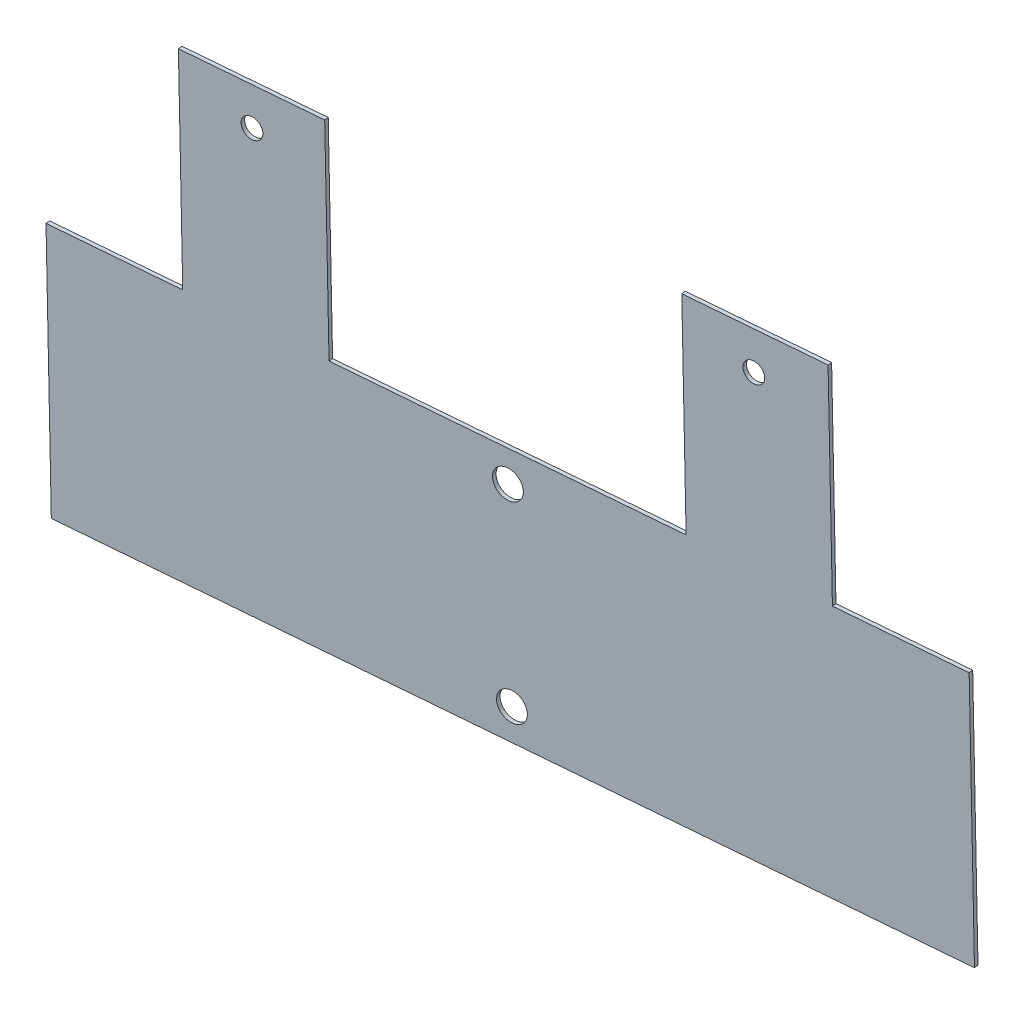
ISO-10303-21;
HEADER;
FILE_DESCRIPTION(('STEP AP214'),'2;1');
FILE_NAME('part.step','',(''),(''),'','','');
FILE_SCHEMA(('AUTOMOTIVE_DESIGN { 1 0 10303 214 1 1 1 1 }'));
ENDSEC;
DATA;
#1=APPLICATION_CONTEXT('core data for automotive mechanical design processes');
#2=APPLICATION_PROTOCOL_DEFINITION('international standard','automotive_design',2000,#1);
#3=PRODUCT_CONTEXT('',#1,'mechanical');
#4=PRODUCT('Part','Part','',(#3));
#5=PRODUCT_RELATED_PRODUCT_CATEGORY('part','',(#4));
#6=PRODUCT_DEFINITION_FORMATION('','',#4);
#7=PRODUCT_DEFINITION_CONTEXT('part definition',#1,'design');
#8=PRODUCT_DEFINITION('design','',#6,#7);
#9=PRODUCT_DEFINITION_SHAPE('','',#8);
#10=(LENGTH_UNIT() NAMED_UNIT(*) SI_UNIT(.MILLI.,.METRE.));
#11=(NAMED_UNIT(*) PLANE_ANGLE_UNIT() SI_UNIT($,.RADIAN.));
#12=(NAMED_UNIT(*) SI_UNIT($,.STERADIAN.) SOLID_ANGLE_UNIT());
#13=UNCERTAINTY_MEASURE_WITH_UNIT(LENGTH_MEASURE(1.E-05),#10,'distance_accuracy_value','');
#14=(GEOMETRIC_REPRESENTATION_CONTEXT(3) GLOBAL_UNCERTAINTY_ASSIGNED_CONTEXT((#13)) GLOBAL_UNIT_ASSIGNED_CONTEXT((#10,
#11,#12)) REPRESENTATION_CONTEXT('',''));
#15=CARTESIAN_POINT('',(0.,0.,0.));
#16=DIRECTION('',(0.,0.,1.));
#17=DIRECTION('',(1.,0.,0.));
#18=AXIS2_PLACEMENT_3D('',#15,#16,#17);
#19=CARTESIAN_POINT('',(-501.489956429642,-328.947406139133,240.499575413323));
#20=DIRECTION('',(0.99656940991837,0.00195950965151666,-0.0827379691367708));
#21=DIRECTION('',(-0.0827381279808112,0.,-0.996571323176736));
#22=AXIS2_PLACEMENT_3D('',#19,#20,#21);
#23=PLANE('',#22);
#24=DIRECTION('',(-0.00028055772663787,0.999793911631424,0.0202991515117986));
#25=VECTOR('',#24,1.);
#26=CARTESIAN_POINT('',(-501.439505510465,-328.959723900019,241.106959260261));
#27=LINE('',#26,#25);
#28=CARTESIAN_POINT('',(-501.439505510465,-328.959723900019,241.106959260261));
#29=VERTEX_POINT('',#28);
#30=CARTESIAN_POINT('',(-501.450907376476,-288.328099331318,241.9319167777));
#31=VERTEX_POINT('',#30);
#32=EDGE_CURVE('E176',#29,#31,#27,.T.);
#33=ORIENTED_EDGE('',*,*,#32,.T.);
#34=DIRECTION('',(0.082760694186997,-0.0202063006674291,0.99636457831008));
#35=VECTOR('',#34,1.);
#36=CARTESIAN_POINT('',(-501.501358295652,-288.315781570432,241.324532930762));
#37=LINE('',#36,#35);
#38=CARTESIAN_POINT('',(-501.501358295652,-288.315781570432,241.324532930762));
#39=VERTEX_POINT('',#38);
#40=EDGE_CURVE('E12',#39,#31,#37,.T.);
#41=ORIENTED_EDGE('',*,*,#40,.F.);
#42=DIRECTION('',(-0.00028055772663787,0.999793911631424,0.0202991515117986));
#43=VECTOR('',#42,1.);
#44=CARTESIAN_POINT('',(-501.489956429642,-328.947406139133,240.499575413323));
#45=LINE('',#44,#43);
#46=CARTESIAN_POINT('',(-501.489956429642,-328.947406139133,240.499575413323));
#47=VERTEX_POINT('',#46);
#48=EDGE_CURVE('E212',#47,#39,#45,.T.);
#49=ORIENTED_EDGE('',*,*,#48,.F.);
#50=DIRECTION('',(0.082760694186997,-0.0202063006674291,0.99636457831008));
#51=VECTOR('',#50,1.);
#52=CARTESIAN_POINT('',(-501.489956429642,-328.947406139133,240.499575413323));
#53=LINE('',#52,#51);
#54=EDGE_CURVE('E172',#47,#29,#53,.T.);
#55=ORIENTED_EDGE('',*,*,#54,.T.);
#56=EDGE_LOOP('',(#33,#41,#49,#55));
#57=FACE_BOUND('',#56,.T.);
#58=ADVANCED_FACE('F49',(#57),#23,.F.);
#59=CARTESIAN_POINT('',(-501.501358295652,-288.315781570432,241.324532930762));
#60=DIRECTION('',(0.000280557726639362,-0.999793911631424,-0.0202991515117987));
#61=DIRECTION('',(0.,0.0202991523106987,-0.999793950979634));
#62=AXIS2_PLACEMENT_3D('',#59,#60,#61);
#63=PLANE('',#62);
#64=DIRECTION('',(0.99656940991837,0.00195950965151815,-0.0827379691367705));
#65=VECTOR('',#64,1.);
#66=CARTESIAN_POINT('',(-501.450907376476,-288.328099331318,241.9319167777));
#67=LINE('',#66,#65);
#68=CARTESIAN_POINT('',(-481.580309912113,-288.289028668377,240.282204411082));
#69=VERTEX_POINT('',#68);
#70=EDGE_CURVE('E180',#31,#69,#67,.T.);
#71=ORIENTED_EDGE('',*,*,#70,.T.);
#72=DIRECTION('',(0.082760694186997,-0.0202063006674291,0.99636457831008));
#73=VECTOR('',#72,1.);
#74=CARTESIAN_POINT('',(-481.63076083129,-288.27671090749,239.674820564144));
#75=LINE('',#74,#73);
#76=CARTESIAN_POINT('',(-481.63076083129,-288.27671090749,239.674820564144));
#77=VERTEX_POINT('',#76);
#78=EDGE_CURVE('E58',#77,#69,#75,.T.);
#79=ORIENTED_EDGE('',*,*,#78,.F.);
#80=DIRECTION('',(0.99656940991837,0.00195950965151815,-0.0827379691367705));
#81=VECTOR('',#80,1.);
#82=CARTESIAN_POINT('',(-501.501358295652,-288.315781570432,241.324532930762));
#83=LINE('',#82,#81);
#84=EDGE_CURVE('E119',#39,#77,#83,.T.);
#85=ORIENTED_EDGE('',*,*,#84,.F.);
#86=ORIENTED_EDGE('',*,*,#40,.T.);
#87=EDGE_LOOP('',(#71,#79,#85,#86));
#88=FACE_BOUND('',#87,.T.);
#89=ADVANCED_FACE('F357',(#88),#63,.F.);
#90=CARTESIAN_POINT('',(-481.63076083129,-288.27671090749,239.674820564144));
#91=DIRECTION('',(0.99656940991837,0.00195950965151761,-0.0827379691367708));
#92=DIRECTION('',(-0.0827381279808112,0.,-0.996571323176736));
#93=AXIS2_PLACEMENT_3D('',#90,#91,#92);
#94=PLANE('',#93);
#95=DIRECTION('',(-0.000280557726638828,0.999793911631424,0.0202991515117985));
#96=VECTOR('',#95,1.);
#97=CARTESIAN_POINT('',(-481.580309912113,-288.289028668377,240.282204411082));
#98=LINE('',#97,#96);
#99=CARTESIAN_POINT('',(-481.589628158372,-255.082579541952,240.956406098194));
#100=VERTEX_POINT('',#99);
#101=EDGE_CURVE('E184',#69,#100,#98,.T.);
#102=ORIENTED_EDGE('',*,*,#101,.T.);
#103=DIRECTION('',(0.082760694186997,-0.0202063006674291,0.99636457831008));
#104=VECTOR('',#103,1.);
#105=CARTESIAN_POINT('',(-481.640079077549,-255.070261781065,240.349022251256));
#106=LINE('',#105,#104);
#107=CARTESIAN_POINT('',(-481.640079077549,-255.070261781065,240.349022251256));
#108=VERTEX_POINT('',#107);
#109=EDGE_CURVE('E238',#108,#100,#106,.T.);
#110=ORIENTED_EDGE('',*,*,#109,.F.);
#111=DIRECTION('',(-0.000280557726638828,0.999793911631424,0.0202991515117985));
#112=VECTOR('',#111,1.);
#113=CARTESIAN_POINT('',(-481.63076083129,-288.27671090749,239.674820564144));
#114=LINE('',#113,#112);
#115=EDGE_CURVE('E248',#77,#108,#114,.T.);
#116=ORIENTED_EDGE('',*,*,#115,.F.);
#117=ORIENTED_EDGE('',*,*,#78,.T.);
#118=EDGE_LOOP('',(#102,#110,#116,#117));
#119=FACE_BOUND('',#118,.T.);
#120=ADVANCED_FACE('F246',(#119),#94,.F.);
#121=CARTESIAN_POINT('',(-481.640079077549,-255.070261781065,240.349022251256));
#122=DIRECTION('',(0.000280557726637702,-0.999793911631424,-0.0202991515117986));
#123=DIRECTION('',(0.,0.0202991523106985,-0.999793950979634));
#124=AXIS2_PLACEMENT_3D('',#121,#122,#123);
#125=PLANE('',#124);
#126=DIRECTION('',(0.99656940991837,0.00195950965151649,-0.0827379691367709));
#127=VECTOR('',#126,1.);
#128=CARTESIAN_POINT('',(-481.589628158372,-255.082579541952,240.956406098194));
#129=LINE('',#128,#127);
#130=CARTESIAN_POINT('',(-460.326823228354,-255.040771444027,239.191108788692));
#131=VERTEX_POINT('',#130);
#132=EDGE_CURVE('E187',#100,#131,#129,.T.);
#133=ORIENTED_EDGE('',*,*,#132,.T.);
#134=DIRECTION('',(0.082760694186997,-0.0202063006674291,0.99636457831008));
#135=VECTOR('',#134,1.);
#136=CARTESIAN_POINT('',(-460.37727414753,-255.028453683141,238.583724941754));
#137=LINE('',#136,#135);
#138=CARTESIAN_POINT('',(-460.37727414753,-255.028453683141,238.583724941754));
#139=VERTEX_POINT('',#138);
#140=EDGE_CURVE('E234',#139,#131,#137,.T.);
#141=ORIENTED_EDGE('',*,*,#140,.F.);
#142=DIRECTION('',(0.99656940991837,0.00195950965151649,-0.0827379691367709));
#143=VECTOR('',#142,1.);
#144=CARTESIAN_POINT('',(-481.640079077549,-255.070261781065,240.349022251256));
#145=LINE('',#144,#143);
#146=EDGE_CURVE('E265',#108,#139,#145,.T.);
#147=ORIENTED_EDGE('',*,*,#146,.F.);
#148=ORIENTED_EDGE('',*,*,#109,.T.);
#149=EDGE_LOOP('',(#133,#141,#147,#148));
#150=FACE_BOUND('',#149,.T.);
#151=ADVANCED_FACE('F255',(#150),#125,.F.);
#152=CARTESIAN_POINT('',(-460.367955901271,-288.234902809565,237.909523254642));
#153=DIRECTION('',(-0.99656940991837,-0.00195950965151761,0.0827379691367708));
#154=DIRECTION('',(0.0827381279808112,0.,0.996571323176736));
#155=AXIS2_PLACEMENT_3D('',#152,#153,#154);
#156=PLANE('',#155);
#157=DIRECTION('',(0.000280557726638828,-0.999793911631424,-0.0202991515117985));
#158=VECTOR('',#157,1.);
#159=CARTESIAN_POINT('',(-460.317504982095,-288.247220570452,238.51690710158));
#160=LINE('',#159,#158);
#161=CARTESIAN_POINT('',(-460.317504982095,-288.247220570452,238.51690710158));
#162=VERTEX_POINT('',#161);
#163=EDGE_CURVE('E190',#131,#162,#160,.T.);
#164=ORIENTED_EDGE('',*,*,#163,.T.);
#165=DIRECTION('',(0.082760694186997,-0.0202063006674291,0.99636457831008));
#166=VECTOR('',#165,1.);
#167=CARTESIAN_POINT('',(-460.367955901271,-288.234902809565,237.909523254642));
#168=LINE('',#167,#166);
#169=CARTESIAN_POINT('',(-460.367955901271,-288.234902809565,237.909523254642));
#170=VERTEX_POINT('',#169);
#171=EDGE_CURVE('E230',#170,#162,#168,.T.);
#172=ORIENTED_EDGE('',*,*,#171,.F.);
#173=DIRECTION('',(0.000280557726638828,-0.999793911631424,-0.0202991515117985));
#174=VECTOR('',#173,1.);
#175=CARTESIAN_POINT('',(-460.367955901271,-288.234902809565,237.909523254642));
#176=LINE('',#175,#174);
#177=EDGE_CURVE('E261',#139,#170,#176,.T.);
#178=ORIENTED_EDGE('',*,*,#177,.F.);
#179=ORIENTED_EDGE('',*,*,#140,.T.);
#180=EDGE_LOOP('',(#164,#172,#178,#179));
#181=FACE_BOUND('',#180,.T.);
#182=ADVANCED_FACE('F259',(#181),#156,.F.);
#183=CARTESIAN_POINT('',(-460.367955901271,-288.234902809565,237.909523254642));
#184=DIRECTION('',(0.000280557726638659,-0.999793911631424,-0.0202991515117987));
#185=DIRECTION('',(0.,0.0202991523106986,-0.999793950979634));
#186=AXIS2_PLACEMENT_3D('',#183,#184,#185);
#187=PLANE('',#186);
#188=DIRECTION('',(0.99656940991837,0.00195950965151746,-0.0827379691367711));
#189=VECTOR('',#188,1.);
#190=CARTESIAN_POINT('',(-460.317504982095,-288.247220570452,238.51690710158));
#191=LINE('',#190,#189);
#192=CARTESIAN_POINT('',(-408.426135807645,-288.145188902897,234.208741048628));
#193=VERTEX_POINT('',#192);
#194=EDGE_CURVE('E193',#162,#193,#191,.T.);
#195=ORIENTED_EDGE('',*,*,#194,.T.);
#196=DIRECTION('',(0.082760694186997,-0.0202063006674291,0.99636457831008));
#197=VECTOR('',#196,1.);
#198=CARTESIAN_POINT('',(-408.476586726822,-288.132871142011,233.60135720169));
#199=LINE('',#198,#197);
#200=CARTESIAN_POINT('',(-408.476586726822,-288.132871142011,233.60135720169));
#201=VERTEX_POINT('',#200);
#202=EDGE_CURVE('E226',#201,#193,#199,.T.);
#203=ORIENTED_EDGE('',*,*,#202,.F.);
#204=DIRECTION('',(0.99656940991837,0.00195950965151746,-0.0827379691367711));
#205=VECTOR('',#204,1.);
#206=CARTESIAN_POINT('',(-460.367955901271,-288.234902809565,237.909523254642));
#207=LINE('',#206,#205);
#208=EDGE_CURVE('E264',#170,#201,#207,.T.);
#209=ORIENTED_EDGE('',*,*,#208,.F.);
#210=ORIENTED_EDGE('',*,*,#171,.T.);
#211=EDGE_LOOP('',(#195,#203,#209,#210));
#212=FACE_BOUND('',#211,.T.);
#213=ADVANCED_FACE('F370',(#212),#187,.F.);
#214=CARTESIAN_POINT('',(-408.476586726822,-288.132871142011,233.60135720169));
#215=DIRECTION('',(0.99656940991837,0.00195950965151767,-0.0827379691367708));
#216=DIRECTION('',(-0.0827381279808112,0.,-0.996571323176736));
#217=AXIS2_PLACEMENT_3D('',#214,#215,#216);
#218=PLANE('',#217);
#219=DIRECTION('',(-0.000280557726638828,0.999793911631424,0.0202991515117993));
#220=VECTOR('',#219,1.);
#221=CARTESIAN_POINT('',(-408.426135807645,-288.145188902897,234.208741048628));
#222=LINE('',#221,#220);
#223=CARTESIAN_POINT('',(-408.435454053904,-254.938739776473,234.88294273574));
#224=VERTEX_POINT('',#223);
#225=EDGE_CURVE('E196',#193,#224,#222,.T.);
#226=ORIENTED_EDGE('',*,*,#225,.T.);
#227=DIRECTION('',(0.082760694186997,-0.0202063006674291,0.99636457831008));
#228=VECTOR('',#227,1.);
#229=CARTESIAN_POINT('',(-408.485904973081,-254.926422015586,234.275558888802));
#230=LINE('',#229,#228);
#231=CARTESIAN_POINT('',(-408.485904973081,-254.926422015586,234.275558888802));
#232=VERTEX_POINT('',#231);
#233=EDGE_CURVE('E222',#232,#224,#230,.T.);
#234=ORIENTED_EDGE('',*,*,#233,.F.);
#235=DIRECTION('',(-0.000280557726638828,0.999793911631424,0.0202991515117993));
#236=VECTOR('',#235,1.);
#237=CARTESIAN_POINT('',(-408.476586726822,-288.132871142011,233.60135720169));
#238=LINE('',#237,#236);
#239=EDGE_CURVE('E269',#201,#232,#238,.T.);
#240=ORIENTED_EDGE('',*,*,#239,.F.);
#241=ORIENTED_EDGE('',*,*,#202,.T.);
#242=EDGE_LOOP('',(#226,#234,#240,#241));
#243=FACE_BOUND('',#242,.T.);
#244=ADVANCED_FACE('F373',(#243),#218,.F.);
#245=CARTESIAN_POINT('',(-408.485904973081,-254.926422015586,234.275558888802));
#246=DIRECTION('',(0.000280557726637702,-0.999793911631424,-0.0202991515117986));
#247=DIRECTION('',(0.,0.0202991523106985,-0.999793950979634));
#248=AXIS2_PLACEMENT_3D('',#245,#246,#247);
#249=PLANE('',#248);
#250=DIRECTION('',(0.99656940991837,0.00195950965151649,-0.0827379691367709));
#251=VECTOR('',#250,1.);
#252=CARTESIAN_POINT('',(-408.435454053904,-254.938739776473,234.88294273574));
#253=LINE('',#252,#251);
#254=CARTESIAN_POINT('',(-387.172649123886,-254.896931678548,233.117645426238));
#255=VERTEX_POINT('',#254);
#256=EDGE_CURVE('E199',#224,#255,#253,.T.);
#257=ORIENTED_EDGE('',*,*,#256,.T.);
#258=DIRECTION('',(0.082760694186997,-0.0202063006674291,0.99636457831008));
#259=VECTOR('',#258,1.);
#260=CARTESIAN_POINT('',(-387.223100043062,-254.884613917661,232.5102615793));
#261=LINE('',#260,#259);
#262=CARTESIAN_POINT('',(-387.223100043062,-254.884613917661,232.5102615793));
#263=VERTEX_POINT('',#262);
#264=EDGE_CURVE('E218',#263,#255,#261,.T.);
#265=ORIENTED_EDGE('',*,*,#264,.F.);
#266=DIRECTION('',(0.99656940991837,0.00195950965151649,-0.0827379691367709));
#267=VECTOR('',#266,1.);
#268=CARTESIAN_POINT('',(-408.485904973081,-254.926422015586,234.275558888802));
#269=LINE('',#268,#267);
#270=EDGE_CURVE('E276',#232,#263,#269,.T.);
#271=ORIENTED_EDGE('',*,*,#270,.F.);
#272=ORIENTED_EDGE('',*,*,#233,.T.);
#273=EDGE_LOOP('',(#257,#265,#271,#272));
#274=FACE_BOUND('',#273,.T.);
#275=ADVANCED_FACE('F284',(#274),#249,.F.);
#276=CARTESIAN_POINT('',(-387.213781796803,-288.091063044086,231.836059892188));
#277=DIRECTION('',(-0.99656940991837,-0.00195950965151761,0.0827379691367708));
#278=DIRECTION('',(0.0827381279808112,0.,0.996571323176736));
#279=AXIS2_PLACEMENT_3D('',#276,#277,#278);
#280=PLANE('',#279);
#281=DIRECTION('',(0.000280557726638828,-0.999793911631424,-0.0202991515117985));
#282=VECTOR('',#281,1.);
#283=CARTESIAN_POINT('',(-387.163330877627,-288.103380804973,232.443443739126));
#284=LINE('',#283,#282);
#285=CARTESIAN_POINT('',(-387.163330877627,-288.103380804973,232.443443739126));
#286=VERTEX_POINT('',#285);
#287=EDGE_CURVE('E202',#255,#286,#284,.T.);
#288=ORIENTED_EDGE('',*,*,#287,.T.);
#289=DIRECTION('',(0.082760694186997,-0.0202063006674291,0.99636457831008));
#290=VECTOR('',#289,1.);
#291=CARTESIAN_POINT('',(-387.213781796803,-288.091063044086,231.836059892188));
#292=LINE('',#291,#290);
#293=CARTESIAN_POINT('',(-387.213781796803,-288.091063044086,231.836059892188));
#294=VERTEX_POINT('',#293);
#295=EDGE_CURVE('E164',#294,#286,#292,.T.);
#296=ORIENTED_EDGE('',*,*,#295,.F.);
#297=DIRECTION('',(0.000280557726638828,-0.999793911631424,-0.0202991515117985));
#298=VECTOR('',#297,1.);
#299=CARTESIAN_POINT('',(-387.213781796803,-288.091063044086,231.836059892188));
#300=LINE('',#299,#298);
#301=EDGE_CURVE('E151',#263,#294,#300,.T.);
#302=ORIENTED_EDGE('',*,*,#301,.F.);
#303=ORIENTED_EDGE('',*,*,#264,.T.);
#304=EDGE_LOOP('',(#288,#296,#302,#303));
#305=FACE_BOUND('',#304,.T.);
#306=ADVANCED_FACE('F288',(#305),#280,.F.);
#307=CARTESIAN_POINT('',(-387.213781796803,-288.091063044086,231.836059892188));
#308=DIRECTION('',(0.000280557726639362,-0.999793911631424,-0.0202991515117987));
#309=DIRECTION('',(0.,0.0202991523106987,-0.999793950979634));
#310=AXIS2_PLACEMENT_3D('',#307,#308,#309);
#311=PLANE('',#310);
#312=DIRECTION('',(0.99656940991837,0.00195950965151815,-0.0827379691367705));
#313=VECTOR('',#312,1.);
#314=CARTESIAN_POINT('',(-387.163330877627,-288.103380804973,232.443443739126));
#315=LINE('',#314,#313);
#316=CARTESIAN_POINT('',(-367.292733413265,-288.064310142031,230.793731372508));
#317=VERTEX_POINT('',#316);
#318=EDGE_CURVE('E161',#286,#317,#315,.T.);
#319=ORIENTED_EDGE('',*,*,#318,.T.);
#320=DIRECTION('',(0.082760694186997,-0.0202063006674291,0.99636457831008));
#321=VECTOR('',#320,1.);
#322=CARTESIAN_POINT('',(-367.343184332441,-288.051992381144,230.18634752557));
#323=LINE('',#322,#321);
#324=CARTESIAN_POINT('',(-367.343184332441,-288.051992381144,230.18634752557));
#325=VERTEX_POINT('',#324);
#326=EDGE_CURVE('E158',#325,#317,#323,.T.);
#327=ORIENTED_EDGE('',*,*,#326,.F.);
#328=DIRECTION('',(0.99656940991837,0.00195950965151815,-0.0827379691367705));
#329=VECTOR('',#328,1.);
#330=CARTESIAN_POINT('',(-387.213781796803,-288.091063044086,231.836059892188));
#331=LINE('',#330,#329);
#332=EDGE_CURVE('E144',#294,#325,#331,.T.);
#333=ORIENTED_EDGE('',*,*,#332,.F.);
#334=ORIENTED_EDGE('',*,*,#295,.T.);
#335=EDGE_LOOP('',(#319,#327,#333,#334));
#336=FACE_BOUND('',#335,.T.);
#337=ADVANCED_FACE('F159',(#336),#311,.F.);
#338=CARTESIAN_POINT('',(-367.331782466431,-328.683616949845,229.361390008131));
#339=DIRECTION('',(-0.99656940991837,-0.00195950965151394,0.0827379691367708));
#340=DIRECTION('',(0.0827381279808113,0.,0.996571323176736));
#341=AXIS2_PLACEMENT_3D('',#338,#339,#340);
#342=PLANE('',#341);
#343=DIRECTION('',(0.000280557726635138,-0.999793911631424,-0.0202991515117986));
#344=VECTOR('',#343,1.);
#345=CARTESIAN_POINT('',(-367.281331547254,-328.695934710732,229.968773855068));
#346=LINE('',#345,#344);
#347=CARTESIAN_POINT('',(-367.281331547254,-328.695934710732,229.968773855068));
#348=VERTEX_POINT('',#347);
#349=EDGE_CURVE('E207',#317,#348,#346,.T.);
#350=ORIENTED_EDGE('',*,*,#349,.T.);
#351=DIRECTION('',(0.082760694186997,-0.0202063006674291,0.99636457831008));
#352=VECTOR('',#351,1.);
#353=CARTESIAN_POINT('',(-367.331782466431,-328.683616949845,229.361390008131));
#354=LINE('',#353,#352);
#355=CARTESIAN_POINT('',(-367.331782466431,-328.683616949845,229.361390008131));
#356=VERTEX_POINT('',#355);
#357=EDGE_CURVE('E165',#356,#348,#354,.T.);
#358=ORIENTED_EDGE('',*,*,#357,.F.);
#359=DIRECTION('',(0.000280557726635138,-0.999793911631424,-0.0202991515117986));
#360=VECTOR('',#359,1.);
#361=CARTESIAN_POINT('',(-367.331782466431,-328.683616949845,229.361390008131));
#362=LINE('',#361,#360);
#363=EDGE_CURVE('E148',#325,#356,#362,.T.);
#364=ORIENTED_EDGE('',*,*,#363,.F.);
#365=ORIENTED_EDGE('',*,*,#326,.T.);
#366=EDGE_LOOP('',(#350,#358,#364,#365));
#367=FACE_BOUND('',#366,.T.);
#368=ADVANCED_FACE('F167',(#367),#342,.F.);
#369=CARTESIAN_POINT('',(-501.489956429642,-328.947406139133,240.499575413323));
#370=DIRECTION('',(-0.000280557726639362,0.999793911631424,0.0202991515117987));
#371=DIRECTION('',(0.,-0.0202991523106987,0.999793950979634));
#372=AXIS2_PLACEMENT_3D('',#369,#370,#371);
#373=PLANE('',#372);
#374=DIRECTION('',(-0.99656940991837,-0.00195950965151815,0.0827379691367705));
#375=VECTOR('',#374,1.);
#376=CARTESIAN_POINT('',(-501.439505510465,-328.959723900019,241.106959260261));
#377=LINE('',#376,#375);
#378=EDGE_CURVE('E107',#348,#29,#377,.T.);
#379=ORIENTED_EDGE('',*,*,#378,.T.);
#380=ORIENTED_EDGE('',*,*,#54,.F.);
#381=DIRECTION('',(-0.99656940991837,-0.00195950965151794,0.0827379691367709));
#382=VECTOR('',#381,1.);
#383=CARTESIAN_POINT('',(-386.587283527019,-328.721478176367,230.960035357474));
#384=LINE('',#383,#382);
#385=EDGE_CURVE('E66',#356,#47,#384,.T.);
#386=ORIENTED_EDGE('',*,*,#385,.F.);
#387=ORIENTED_EDGE('',*,*,#357,.T.);
#388=EDGE_LOOP('',(#379,#380,#386,#387));
#389=FACE_BOUND('',#388,.T.);
#390=ADVANCED_FACE('F289',(#389),#373,.F.);
#391=CARTESIAN_POINT('',(16.9467758676456,-4.13761208613666,204.023991786853));
#392=DIRECTION('',(-0.0827606941869968,0.0202063006674291,-0.99636457831008));
#393=DIRECTION('',(-0.996568045750024,0.,0.0827775947341869));
#394=AXIS2_PLACEMENT_3D('',#391,#392,#393);
#395=PLANE('',#394);
#396=CARTESIAN_POINT('',(-471.054813760999,-261.10108861582,239.347476604441));
#397=DIRECTION('',(-0.0827606941869969,0.0202063006674291,-0.99636457831008));
#398=DIRECTION('',(-0.996568045750024,0.,0.0827775947341869));
#399=AXIS2_PLACEMENT_3D('',#396,#397,#398);
#400=CIRCLE('',#399,1.58750000000002);
#401=CARTESIAN_POINT('',(-472.636865533627,-261.10108861582,239.478886036081));
#402=VERTEX_POINT('',#401);
#403=EDGE_CURVE('E326',#402,#402,#400,.T.);
#404=ORIENTED_EDGE('',*,*,#403,.F.);
#405=EDGE_LOOP('',(#404));
#406=FACE_BOUND('',#405,.T.);
#407=CARTESIAN_POINT('',(-398.13117772993,-260.957702145591,233.293153155214));
#408=DIRECTION('',(-0.0827606941869968,0.0202063006674291,-0.99636457831008));
#409=DIRECTION('',(-0.996568045750024,0.,0.0827775947341869));
#410=AXIS2_PLACEMENT_3D('',#407,#408,#409);
#411=CIRCLE('',#410,1.58750000000003);
#412=CARTESIAN_POINT('',(-399.713229502559,-260.957702145591,233.424562586854));
#413=VERTEX_POINT('',#412);
#414=EDGE_CURVE('E318',#413,#413,#411,.T.);
#415=ORIENTED_EDGE('',*,*,#414,.F.);
#416=EDGE_LOOP('',(#415));
#417=FACE_BOUND('',#416,.T.);
#418=CARTESIAN_POINT('',(-434.464565062866,-293.182942453393,235.657572278879));
#419=DIRECTION('',(0.0827606941869969,-0.0202063006674292,0.99636457831008));
#420=DIRECTION('',(-0.996566946014347,-0.00391901177606996,0.0826980257221201));
#421=AXIS2_PLACEMENT_3D('',#418,#419,#420);
#422=CIRCLE('',#421,2.24999999999995);
#423=CARTESIAN_POINT('',(-436.706840691398,-293.191760229889,235.843642836754));
#424=VERTEX_POINT('',#423);
#425=EDGE_CURVE('E310',#424,#424,#422,.T.);
#426=ORIENTED_EDGE('',*,*,#425,.T.);
#427=EDGE_LOOP('',(#426));
#428=FACE_BOUND('',#427,.T.);
#429=CARTESIAN_POINT('',(-434.455968774122,-323.816627903961,235.035606276595));
#430=DIRECTION('',(-0.0827606941869969,0.0202063006674291,-0.99636457831008));
#431=DIRECTION('',(-0.996568045750024,0.,0.0827775947341869));
#432=AXIS2_PLACEMENT_3D('',#429,#430,#431);
#433=CIRCLE('',#432,2.24999999999995);
#434=CARTESIAN_POINT('',(-436.69824687706,-323.816627903961,235.221855864746));
#435=VERTEX_POINT('',#434);
#436=EDGE_CURVE('E302',#435,#435,#433,.T.);
#437=ORIENTED_EDGE('',*,*,#436,.F.);
#438=EDGE_LOOP('',(#437));
#439=FACE_BOUND('',#438,.T.);
#440=ORIENTED_EDGE('',*,*,#48,.T.);
#441=ORIENTED_EDGE('',*,*,#84,.T.);
#442=ORIENTED_EDGE('',*,*,#115,.T.);
#443=ORIENTED_EDGE('',*,*,#146,.T.);
#444=ORIENTED_EDGE('',*,*,#177,.T.);
#445=ORIENTED_EDGE('',*,*,#208,.T.);
#446=ORIENTED_EDGE('',*,*,#239,.T.);
#447=ORIENTED_EDGE('',*,*,#270,.T.);
#448=ORIENTED_EDGE('',*,*,#301,.T.);
#449=ORIENTED_EDGE('',*,*,#332,.T.);
#450=ORIENTED_EDGE('',*,*,#363,.T.);
#451=ORIENTED_EDGE('',*,*,#385,.T.);
#452=EDGE_LOOP('',(#440,#441,#442,#443,#444,#445,#446,#447,#448,#449,#450,#451));
#453=FACE_BOUND('',#452,.T.);
#454=ADVANCED_FACE('F146',(#406,#417,#428,#439,#453),#395,.T.);
#455=CARTESIAN_POINT('',(16.997226786822,-4.14992984702352,204.631375633791));
#456=DIRECTION('',(-0.0827606941869968,0.0202063006674291,-0.99636457831008));
#457=DIRECTION('',(-0.996568045750024,0.,0.0827775947341869));
#458=AXIS2_PLACEMENT_3D('',#455,#456,#457);
#459=PLANE('',#458);
#460=CARTESIAN_POINT('',(-471.004362841823,-261.113406376707,239.954860451379));
#461=DIRECTION('',(-0.0827606941869968,0.0202063006674291,-0.99636457831008));
#462=DIRECTION('',(-0.996568045750024,0.,0.0827775947341869));
#463=AXIS2_PLACEMENT_3D('',#460,#461,#462);
#464=CIRCLE('',#463,1.58750000000002);
#465=CARTESIAN_POINT('',(-472.586414614451,-261.113406376707,240.086269883019));
#466=VERTEX_POINT('',#465);
#467=EDGE_CURVE('E322',#466,#466,#464,.F.);
#468=ORIENTED_EDGE('',*,*,#467,.F.);
#469=EDGE_LOOP('',(#468));
#470=FACE_BOUND('',#469,.T.);
#471=CARTESIAN_POINT('',(-398.080726810754,-260.970019906477,233.900537002151));
#472=DIRECTION('',(-0.0827606941869968,0.0202063006674291,-0.99636457831008));
#473=DIRECTION('',(-0.996568045750024,0.,0.0827775947341869));
#474=AXIS2_PLACEMENT_3D('',#471,#472,#473);
#475=CIRCLE('',#474,1.58750000000003);
#476=CARTESIAN_POINT('',(-399.662778583382,-260.970019906477,234.031946433792));
#477=VERTEX_POINT('',#476);
#478=EDGE_CURVE('E314',#477,#477,#475,.F.);
#479=ORIENTED_EDGE('',*,*,#478,.F.);
#480=EDGE_LOOP('',(#479));
#481=FACE_BOUND('',#480,.T.);
#482=CARTESIAN_POINT('',(-434.414114143689,-293.19526021428,236.264956125817));
#483=DIRECTION('',(-0.0827606941869968,0.0202063006674291,-0.99636457831008));
#484=DIRECTION('',(-0.996568045750024,0.,0.0827775947341869));
#485=AXIS2_PLACEMENT_3D('',#482,#483,#484);
#486=CIRCLE('',#485,2.24999999999995);
#487=CARTESIAN_POINT('',(-436.656392246627,-293.19526021428,236.451205713969));
#488=VERTEX_POINT('',#487);
#489=EDGE_CURVE('E306',#488,#488,#486,.T.);
#490=ORIENTED_EDGE('',*,*,#489,.T.);
#491=EDGE_LOOP('',(#490));
#492=FACE_BOUND('',#491,.T.);
#493=CARTESIAN_POINT('',(-434.405517854946,-323.828945664848,235.642990123532));
#494=DIRECTION('',(-0.0827606941869968,0.0202063006674291,-0.99636457831008));
#495=DIRECTION('',(-0.996568045750024,0.,0.0827775947341869));
#496=AXIS2_PLACEMENT_3D('',#493,#494,#495);
#497=CIRCLE('',#496,2.24999999999995);
#498=CARTESIAN_POINT('',(-436.647795957883,-323.828945664848,235.829239711684));
#499=VERTEX_POINT('',#498);
#500=EDGE_CURVE('E181',#499,#499,#497,.F.);
#501=ORIENTED_EDGE('',*,*,#500,.F.);
#502=EDGE_LOOP('',(#501));
#503=FACE_BOUND('',#502,.T.);
#504=ORIENTED_EDGE('',*,*,#32,.F.);
#505=ORIENTED_EDGE('',*,*,#378,.F.);
#506=ORIENTED_EDGE('',*,*,#349,.F.);
#507=ORIENTED_EDGE('',*,*,#318,.F.);
#508=ORIENTED_EDGE('',*,*,#287,.F.);
#509=ORIENTED_EDGE('',*,*,#256,.F.);
#510=ORIENTED_EDGE('',*,*,#225,.F.);
#511=ORIENTED_EDGE('',*,*,#194,.F.);
#512=ORIENTED_EDGE('',*,*,#163,.F.);
#513=ORIENTED_EDGE('',*,*,#132,.F.);
#514=ORIENTED_EDGE('',*,*,#101,.F.);
#515=ORIENTED_EDGE('',*,*,#70,.F.);
#516=EDGE_LOOP('',(#504,#505,#506,#507,#508,#509,#510,#511,#512,#513,#514,#515));
#517=FACE_BOUND('',#516,.T.);
#518=ADVANCED_FACE('F250',(#470,#481,#492,#503,#517),#459,.F.);
#519=CARTESIAN_POINT('',(-433.878832022268,-323.95753777487,241.983815472246));
#520=DIRECTION('',(-0.0827606941869969,0.0202063006674291,-0.99636457831008));
#521=DIRECTION('',(-0.996568045750024,0.,0.0827775947341869));
#522=AXIS2_PLACEMENT_3D('',#519,#520,#521);
#523=CYLINDRICAL_SURFACE('',#522,2.24999999999995);
#524=ORIENTED_EDGE('',*,*,#500,.T.);
#525=EDGE_LOOP('',(#524));
#526=FACE_BOUND('',#525,.T.);
#527=ORIENTED_EDGE('',*,*,#436,.T.);
#528=EDGE_LOOP('',(#527));
#529=FACE_BOUND('',#528,.T.);
#530=ADVANCED_FACE('F342',(#526,#529),#523,.F.);
#531=CARTESIAN_POINT('',(-433.887428311011,-293.323852324301,242.605781474531));
#532=DIRECTION('',(-0.0827606941869969,0.0202063006674292,-0.99636457831008));
#533=DIRECTION('',(-0.996568045750024,0.,0.0827775947341869));
#534=AXIS2_PLACEMENT_3D('',#531,#532,#533);
#535=CYLINDRICAL_SURFACE('',#534,2.24999999999995);
#536=ORIENTED_EDGE('',*,*,#489,.F.);
#537=EDGE_LOOP('',(#536));
#538=FACE_BOUND('',#537,.T.);
#539=ORIENTED_EDGE('',*,*,#425,.F.);
#540=EDGE_LOOP('',(#539));
#541=FACE_BOUND('',#540,.T.);
#542=ADVANCED_FACE('F344',(#538,#541),#535,.F.);
#543=CARTESIAN_POINT('',(-397.709120695476,-261.060748784104,238.374341553744));
#544=DIRECTION('',(-0.0827606941869968,0.0202063006674291,-0.99636457831008));
#545=DIRECTION('',(-0.996568045750024,0.,0.0827775947341869));
#546=AXIS2_PLACEMENT_3D('',#543,#544,#545);
#547=CYLINDRICAL_SURFACE('',#546,1.58750000000003);
#548=ORIENTED_EDGE('',*,*,#478,.T.);
#549=EDGE_LOOP('',(#548));
#550=FACE_BOUND('',#549,.T.);
#551=ORIENTED_EDGE('',*,*,#414,.T.);
#552=EDGE_LOOP('',(#551));
#553=FACE_BOUND('',#552,.T.);
#554=ADVANCED_FACE('F351',(#550,#553),#547,.F.);
#555=CARTESIAN_POINT('',(-470.632756726544,-261.204135254333,244.428665002971));
#556=DIRECTION('',(-0.0827606941869969,0.0202063006674291,-0.99636457831008));
#557=DIRECTION('',(-0.996568045750024,0.,0.0827775947341869));
#558=AXIS2_PLACEMENT_3D('',#555,#556,#557);
#559=CYLINDRICAL_SURFACE('',#558,1.58750000000002);
#560=ORIENTED_EDGE('',*,*,#467,.T.);
#561=EDGE_LOOP('',(#560));
#562=FACE_BOUND('',#561,.T.);
#563=ORIENTED_EDGE('',*,*,#403,.T.);
#564=EDGE_LOOP('',(#563));
#565=FACE_BOUND('',#564,.T.);
#566=ADVANCED_FACE('F331',(#562,#565),#559,.F.);
#567=CLOSED_SHELL('',(#58,#89,#120,#151,#182,#213,#244,#275,#306,#337,#368,#390,#454,#518,#530,
#542,#554,#566));
#568=MANIFOLD_SOLID_BREP('B2',#567);
#569=ADVANCED_BREP_SHAPE_REPRESENTATION('',(#18,#568),#14);
#570=SHAPE_DEFINITION_REPRESENTATION(#9,#569);
ENDSEC;
END-ISO-10303-21;
